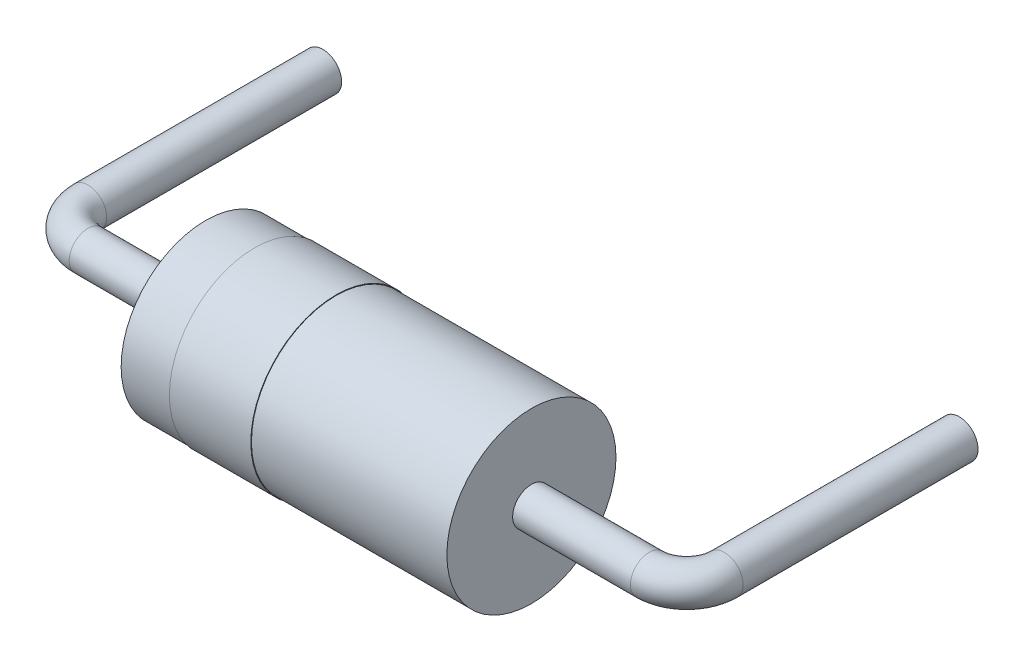
ISO-10303-21;
HEADER;
FILE_DESCRIPTION(('STEP AP214'),'2;1');
FILE_NAME('part.step','',(''),(''),'','','');
FILE_SCHEMA(('AUTOMOTIVE_DESIGN { 1 0 10303 214 1 1 1 1 }'));
ENDSEC;
DATA;
#1=APPLICATION_CONTEXT('core data for automotive mechanical design processes');
#2=APPLICATION_PROTOCOL_DEFINITION('international standard','automotive_design',2000,#1);
#3=PRODUCT_CONTEXT('',#1,'mechanical');
#4=PRODUCT('Part','Part','',(#3));
#5=PRODUCT_RELATED_PRODUCT_CATEGORY('part','',(#4));
#6=PRODUCT_DEFINITION_FORMATION('','',#4);
#7=PRODUCT_DEFINITION_CONTEXT('part definition',#1,'design');
#8=PRODUCT_DEFINITION('design','',#6,#7);
#9=PRODUCT_DEFINITION_SHAPE('','',#8);
#10=(LENGTH_UNIT() NAMED_UNIT(*) SI_UNIT(.MILLI.,.METRE.));
#11=(NAMED_UNIT(*) PLANE_ANGLE_UNIT() SI_UNIT($,.RADIAN.));
#12=(NAMED_UNIT(*) SI_UNIT($,.STERADIAN.) SOLID_ANGLE_UNIT());
#13=UNCERTAINTY_MEASURE_WITH_UNIT(LENGTH_MEASURE(1.E-05),#10,'distance_accuracy_value','');
#14=(GEOMETRIC_REPRESENTATION_CONTEXT(3) GLOBAL_UNCERTAINTY_ASSIGNED_CONTEXT((#13)) GLOBAL_UNIT_ASSIGNED_CONTEXT((#10,
#11,#12)) REPRESENTATION_CONTEXT('',''));
#15=CARTESIAN_POINT('',(0.,0.,0.));
#16=DIRECTION('',(0.,0.,1.));
#17=DIRECTION('',(1.,0.,0.));
#18=AXIS2_PLACEMENT_3D('',#15,#16,#17);
#19=CARTESIAN_POINT('',(9.86,0.,-2.5));
#20=DIRECTION('',(0.,0.,1.));
#21=DIRECTION('',(1.,0.,0.));
#22=AXIS2_PLACEMENT_3D('',#19,#20,#21);
#23=PLANE('',#22);
#24=CARTESIAN_POINT('',(10.16,0.,-2.5));
#25=DIRECTION('',(0.,0.,-1.));
#26=DIRECTION('',(-1.,0.,0.));
#27=AXIS2_PLACEMENT_3D('',#24,#25,#26);
#28=CIRCLE('',#27,0.3);
#29=CARTESIAN_POINT('',(9.86,0.,-2.5));
#30=VERTEX_POINT('',#29);
#31=EDGE_CURVE('E11',#30,#30,#28,.T.);
#32=ORIENTED_EDGE('',*,*,#31,.T.);
#33=EDGE_LOOP('',(#32));
#34=FACE_BOUND('',#33,.T.);
#35=ADVANCED_FACE('F17',(#34),#23,.F.);
#36=CARTESIAN_POINT('',(0.3,0.,-2.5));
#37=DIRECTION('',(0.,0.,-1.));
#38=DIRECTION('',(0.,-1.,0.));
#39=AXIS2_PLACEMENT_3D('',#36,#37,#38);
#40=PLANE('',#39);
#41=CARTESIAN_POINT('',(0.,0.,-2.5));
#42=DIRECTION('',(0.,0.,1.));
#43=DIRECTION('',(1.,0.,0.));
#44=AXIS2_PLACEMENT_3D('',#41,#42,#43);
#45=CIRCLE('',#44,0.3);
#46=CARTESIAN_POINT('',(0.3,0.,-2.5));
#47=VERTEX_POINT('',#46);
#48=EDGE_CURVE('E161',#47,#47,#45,.T.);
#49=ORIENTED_EDGE('',*,*,#48,.F.);
#50=EDGE_LOOP('',(#49));
#51=FACE_BOUND('',#50,.T.);
#52=ADVANCED_FACE('F19',(#51),#40,.T.);
#53=CARTESIAN_POINT('',(10.16,0.,1.25));
#54=DIRECTION('',(0.,0.,-1.));
#55=DIRECTION('',(-1.,0.,0.));
#56=AXIS2_PLACEMENT_3D('',#53,#54,#55);
#57=CYLINDRICAL_SURFACE('',#56,0.3);
#58=DIRECTION('',(0.,0.,-1.));
#59=VECTOR('',#58,1.);
#60=CARTESIAN_POINT('',(9.86,0.,1.25));
#61=LINE('',#60,#59);
#62=CARTESIAN_POINT('',(9.86,0.,1.25));
#63=VERTEX_POINT('',#62);
#64=EDGE_CURVE('E30',#63,#30,#61,.T.);
#65=ORIENTED_EDGE('',*,*,#64,.T.);
#66=ORIENTED_EDGE('',*,*,#31,.F.);
#67=ORIENTED_EDGE('',*,*,#64,.F.);
#68=CARTESIAN_POINT('',(10.16,0.,1.25));
#69=DIRECTION('',(0.,0.,1.));
#70=DIRECTION('',(1.,0.,0.));
#71=AXIS2_PLACEMENT_3D('',#68,#69,#70);
#72=CIRCLE('',#71,0.3);
#73=EDGE_CURVE('E152',#63,#63,#72,.T.);
#74=ORIENTED_EDGE('',*,*,#73,.F.);
#75=EDGE_LOOP('',(#65,#66,#67,#74));
#76=FACE_BOUND('',#75,.T.);
#77=ADVANCED_FACE('F169',(#76),#57,.T.);
#78=CARTESIAN_POINT('',(0.,0.,1.25));
#79=DIRECTION('',(0.,0.,1.));
#80=DIRECTION('',(1.,0.,0.));
#81=AXIS2_PLACEMENT_3D('',#78,#79,#80);
#82=CYLINDRICAL_SURFACE('',#81,0.3);
#83=DIRECTION('',(0.,0.,1.));
#84=VECTOR('',#83,1.);
#85=CARTESIAN_POINT('',(0.3,0.,1.25));
#86=LINE('',#85,#84);
#87=CARTESIAN_POINT('',(0.3,0.,1.25));
#88=VERTEX_POINT('',#87);
#89=EDGE_CURVE('E158',#47,#88,#86,.T.);
#90=ORIENTED_EDGE('',*,*,#89,.T.);
#91=CARTESIAN_POINT('',(0.,0.,1.25));
#92=DIRECTION('',(0.,0.,1.));
#93=DIRECTION('',(1.,0.,0.));
#94=AXIS2_PLACEMENT_3D('',#91,#92,#93);
#95=CIRCLE('',#94,0.3);
#96=EDGE_CURVE('E143',#88,#88,#95,.T.);
#97=ORIENTED_EDGE('',*,*,#96,.F.);
#98=ORIENTED_EDGE('',*,*,#89,.F.);
#99=ORIENTED_EDGE('',*,*,#48,.T.);
#100=EDGE_LOOP('',(#90,#97,#98,#99));
#101=FACE_BOUND('',#100,.T.);
#102=ADVANCED_FACE('F226',(#101),#82,.T.);
#103=CARTESIAN_POINT('',(9.56,0.,1.25));
#104=DIRECTION('',(0.,1.,0.));
#105=DIRECTION('',(1.,0.,0.));
#106=AXIS2_PLACEMENT_3D('',#103,#104,#105);
#107=TOROIDAL_SURFACE('',#106,0.6,0.3);
#108=CARTESIAN_POINT('',(9.56,0.,1.25));
#109=DIRECTION('',(0.,1.,0.));
#110=DIRECTION('',(1.,0.,0.));
#111=AXIS2_PLACEMENT_3D('',#108,#109,#110);
#112=CIRCLE('',#111,0.3);
#113=CARTESIAN_POINT('',(9.56,0.,1.55));
#114=VERTEX_POINT('',#113);
#115=EDGE_CURVE('E147',#114,#63,#112,.T.);
#116=ORIENTED_EDGE('',*,*,#115,.T.);
#117=ORIENTED_EDGE('',*,*,#73,.T.);
#118=ORIENTED_EDGE('',*,*,#115,.F.);
#119=CARTESIAN_POINT('',(9.56,0.,1.85));
#120=DIRECTION('',(1.,0.,0.));
#121=DIRECTION('',(0.,0.,-1.));
#122=AXIS2_PLACEMENT_3D('',#119,#120,#121);
#123=CIRCLE('',#122,0.3);
#124=EDGE_CURVE('E115',#114,#114,#123,.T.);
#125=ORIENTED_EDGE('',*,*,#124,.T.);
#126=EDGE_LOOP('',(#116,#117,#118,#125));
#127=FACE_BOUND('',#126,.T.);
#128=ADVANCED_FACE('F168',(#127),#107,.T.);
#129=CARTESIAN_POINT('',(0.6,0.,1.25));
#130=DIRECTION('',(0.,1.,0.));
#131=DIRECTION('',(1.,0.,0.));
#132=AXIS2_PLACEMENT_3D('',#129,#130,#131);
#133=TOROIDAL_SURFACE('',#132,0.6,0.3);
#134=CARTESIAN_POINT('',(0.6,0.,1.25));
#135=DIRECTION('',(0.,1.,0.));
#136=DIRECTION('',(1.,0.,0.));
#137=AXIS2_PLACEMENT_3D('',#134,#135,#136);
#138=CIRCLE('',#137,0.3);
#139=CARTESIAN_POINT('',(0.6,0.,1.55));
#140=VERTEX_POINT('',#139);
#141=EDGE_CURVE('E116',#88,#140,#138,.T.);
#142=ORIENTED_EDGE('',*,*,#141,.T.);
#143=CARTESIAN_POINT('',(0.6,0.,1.85));
#144=DIRECTION('',(-1.,0.,0.));
#145=DIRECTION('',(0.,0.,1.));
#146=AXIS2_PLACEMENT_3D('',#143,#144,#145);
#147=CIRCLE('',#146,0.3);
#148=EDGE_CURVE('E137',#140,#140,#147,.T.);
#149=ORIENTED_EDGE('',*,*,#148,.T.);
#150=ORIENTED_EDGE('',*,*,#141,.F.);
#151=ORIENTED_EDGE('',*,*,#96,.T.);
#152=EDGE_LOOP('',(#142,#149,#150,#151));
#153=FACE_BOUND('',#152,.T.);
#154=ADVANCED_FACE('F222',(#153),#133,.T.);
#155=CARTESIAN_POINT('',(0.6,0.,1.85));
#156=DIRECTION('',(1.,0.,0.));
#157=DIRECTION('',(0.,0.,-1.));
#158=AXIS2_PLACEMENT_3D('',#155,#156,#157);
#159=CYLINDRICAL_SURFACE('',#158,0.3);
#160=CARTESIAN_POINT('',(7.68,0.,1.85));
#161=DIRECTION('',(1.,0.,0.));
#162=DIRECTION('',(0.,0.,-1.));
#163=AXIS2_PLACEMENT_3D('',#160,#161,#162);
#164=CIRCLE('',#163,0.3);
#165=CARTESIAN_POINT('',(7.68,0.,1.55));
#166=VERTEX_POINT('',#165);
#167=EDGE_CURVE('E128',#166,#166,#164,.T.);
#168=ORIENTED_EDGE('',*,*,#167,.T.);
#169=DIRECTION('',(1.,0.,0.));
#170=VECTOR('',#169,1.);
#171=CARTESIAN_POINT('',(0.6,0.,1.55));
#172=LINE('',#171,#170);
#173=EDGE_CURVE('E117',#166,#114,#172,.T.);
#174=ORIENTED_EDGE('',*,*,#173,.T.);
#175=ORIENTED_EDGE('',*,*,#124,.F.);
#176=ORIENTED_EDGE('',*,*,#173,.F.);
#177=EDGE_LOOP('',(#168,#174,#175,#176));
#178=FACE_BOUND('',#177,.T.);
#179=ADVANCED_FACE('F174',(#178),#159,.T.);
#180=CARTESIAN_POINT('',(0.6,0.,1.85));
#181=DIRECTION('',(1.,0.,0.));
#182=DIRECTION('',(0.,0.,-1.));
#183=AXIS2_PLACEMENT_3D('',#180,#181,#182);
#184=CYLINDRICAL_SURFACE('',#183,0.3);
#185=ORIENTED_EDGE('',*,*,#148,.F.);
#186=DIRECTION('',(1.,0.,0.));
#187=VECTOR('',#186,1.);
#188=CARTESIAN_POINT('',(0.6,0.,1.55));
#189=LINE('',#188,#187);
#190=CARTESIAN_POINT('',(2.48,0.,1.55));
#191=VERTEX_POINT('',#190);
#192=EDGE_CURVE('E135',#140,#191,#189,.T.);
#193=ORIENTED_EDGE('',*,*,#192,.T.);
#194=CARTESIAN_POINT('',(2.48,0.,1.85));
#195=DIRECTION('',(1.,0.,0.));
#196=DIRECTION('',(0.,0.,-1.));
#197=AXIS2_PLACEMENT_3D('',#194,#195,#196);
#198=CIRCLE('',#197,0.3);
#199=EDGE_CURVE('E122',#191,#191,#198,.T.);
#200=ORIENTED_EDGE('',*,*,#199,.F.);
#201=ORIENTED_EDGE('',*,*,#192,.F.);
#202=EDGE_LOOP('',(#185,#193,#200,#201));
#203=FACE_BOUND('',#202,.T.);
#204=ADVANCED_FACE('F179',(#203),#184,.T.);
#205=CARTESIAN_POINT('',(7.68,0.,1.85));
#206=DIRECTION('',(1.,0.,0.));
#207=DIRECTION('',(0.,1.,0.));
#208=AXIS2_PLACEMENT_3D('',#205,#206,#207);
#209=PLANE('',#208);
#210=ORIENTED_EDGE('',*,*,#167,.F.);
#211=EDGE_LOOP('',(#210));
#212=FACE_BOUND('',#211,.T.);
#213=CARTESIAN_POINT('',(7.68,0.,1.85));
#214=DIRECTION('',(1.,0.,0.));
#215=DIRECTION('',(0.,0.,1.));
#216=AXIS2_PLACEMENT_3D('',#213,#214,#215);
#217=CIRCLE('',#216,1.35);
#218=CARTESIAN_POINT('',(7.68,0.,3.2));
#219=VERTEX_POINT('',#218);
#220=EDGE_CURVE('E125',#219,#219,#217,.T.);
#221=ORIENTED_EDGE('',*,*,#220,.T.);
#222=EDGE_LOOP('',(#221));
#223=FACE_BOUND('',#222,.T.);
#224=ADVANCED_FACE('F176',(#212,#223),#209,.T.);
#225=CARTESIAN_POINT('',(2.48,0.,1.85));
#226=DIRECTION('',(1.,0.,0.));
#227=DIRECTION('',(0.,1.,0.));
#228=AXIS2_PLACEMENT_3D('',#225,#226,#227);
#229=PLANE('',#228);
#230=ORIENTED_EDGE('',*,*,#199,.T.);
#231=EDGE_LOOP('',(#230));
#232=FACE_BOUND('',#231,.T.);
#233=CARTESIAN_POINT('',(2.48,0.,1.85));
#234=DIRECTION('',(1.,0.,0.));
#235=DIRECTION('',(0.,0.,1.));
#236=AXIS2_PLACEMENT_3D('',#233,#234,#235);
#237=CIRCLE('',#236,1.35);
#238=CARTESIAN_POINT('',(2.48,0.,3.2));
#239=VERTEX_POINT('',#238);
#240=EDGE_CURVE('E123',#239,#239,#237,.T.);
#241=ORIENTED_EDGE('',*,*,#240,.F.);
#242=EDGE_LOOP('',(#241));
#243=FACE_BOUND('',#242,.T.);
#244=ADVANCED_FACE('F177',(#232,#243),#229,.F.);
#245=CARTESIAN_POINT('',(2.48,0.,1.85));
#246=DIRECTION('',(1.,0.,0.));
#247=DIRECTION('',(0.,0.,1.));
#248=AXIS2_PLACEMENT_3D('',#245,#246,#247);
#249=CYLINDRICAL_SURFACE('',#248,1.35);
#250=CARTESIAN_POINT('',(4.56,0.,1.85));
#251=DIRECTION('',(1.,0.,0.));
#252=DIRECTION('',(0.,0.,1.));
#253=AXIS2_PLACEMENT_3D('',#250,#251,#252);
#254=CIRCLE('',#253,1.35);
#255=CARTESIAN_POINT('',(4.56,0.,3.2));
#256=VERTEX_POINT('',#255);
#257=EDGE_CURVE('E110',#256,#256,#254,.T.);
#258=ORIENTED_EDGE('',*,*,#257,.T.);
#259=DIRECTION('',(1.,0.,0.));
#260=VECTOR('',#259,1.);
#261=CARTESIAN_POINT('',(2.48,0.,3.2));
#262=LINE('',#261,#260);
#263=EDGE_CURVE('E119',#256,#219,#262,.T.);
#264=ORIENTED_EDGE('',*,*,#263,.T.);
#265=ORIENTED_EDGE('',*,*,#220,.F.);
#266=ORIENTED_EDGE('',*,*,#263,.F.);
#267=EDGE_LOOP('',(#258,#264,#265,#266));
#268=FACE_BOUND('',#267,.T.);
#269=ADVANCED_FACE('F182',(#268),#249,.T.);
#270=CARTESIAN_POINT('',(2.48,0.,1.85));
#271=DIRECTION('',(1.,0.,0.));
#272=DIRECTION('',(0.,0.,1.));
#273=AXIS2_PLACEMENT_3D('',#270,#271,#272);
#274=CYLINDRICAL_SURFACE('',#273,1.35);
#275=DIRECTION('',(1.,0.,0.));
#276=VECTOR('',#275,1.);
#277=CARTESIAN_POINT('',(2.48,0.,3.2));
#278=LINE('',#277,#276);
#279=CARTESIAN_POINT('',(3.26,0.,3.2));
#280=VERTEX_POINT('',#279);
#281=EDGE_CURVE('E112',#239,#280,#278,.T.);
#282=ORIENTED_EDGE('',*,*,#281,.F.);
#283=ORIENTED_EDGE('',*,*,#240,.T.);
#284=ORIENTED_EDGE('',*,*,#281,.T.);
#285=CARTESIAN_POINT('',(3.26,0.,1.85));
#286=DIRECTION('',(1.,0.,0.));
#287=DIRECTION('',(0.,0.,1.));
#288=AXIS2_PLACEMENT_3D('',#285,#286,#287);
#289=CIRCLE('',#288,1.35);
#290=EDGE_CURVE('E97',#280,#280,#289,.T.);
#291=ORIENTED_EDGE('',*,*,#290,.F.);
#292=EDGE_LOOP('',(#282,#283,#284,#291));
#293=FACE_BOUND('',#292,.T.);
#294=ADVANCED_FACE('F192',(#293),#274,.T.);
#295=CARTESIAN_POINT('',(4.56,0.,1.85));
#296=DIRECTION('',(1.,0.,0.));
#297=DIRECTION('',(0.,1.,0.));
#298=AXIS2_PLACEMENT_3D('',#295,#296,#297);
#299=PLANE('',#298);
#300=ORIENTED_EDGE('',*,*,#257,.F.);
#301=EDGE_LOOP('',(#300));
#302=FACE_BOUND('',#301,.T.);
#303=CARTESIAN_POINT('',(4.56,0.,1.85));
#304=DIRECTION('',(1.,0.,0.));
#305=DIRECTION('',(0.,0.,1.));
#306=AXIS2_PLACEMENT_3D('',#303,#304,#305);
#307=CIRCLE('',#306,1.36);
#308=CARTESIAN_POINT('',(4.56,0.,3.21));
#309=VERTEX_POINT('',#308);
#310=EDGE_CURVE('E91',#309,#309,#307,.T.);
#311=ORIENTED_EDGE('',*,*,#310,.T.);
#312=EDGE_LOOP('',(#311));
#313=FACE_BOUND('',#312,.T.);
#314=ADVANCED_FACE('F190',(#302,#313),#299,.T.);
#315=CARTESIAN_POINT('',(3.26,0.,1.85));
#316=DIRECTION('',(1.,0.,0.));
#317=DIRECTION('',(0.,1.,0.));
#318=AXIS2_PLACEMENT_3D('',#315,#316,#317);
#319=PLANE('',#318);
#320=ORIENTED_EDGE('',*,*,#290,.T.);
#321=EDGE_LOOP('',(#320));
#322=FACE_BOUND('',#321,.T.);
#323=CARTESIAN_POINT('',(3.26,0.,1.85));
#324=DIRECTION('',(1.,0.,0.));
#325=DIRECTION('',(0.,0.,1.));
#326=AXIS2_PLACEMENT_3D('',#323,#324,#325);
#327=CIRCLE('',#326,1.36);
#328=CARTESIAN_POINT('',(3.26,0.,3.21));
#329=VERTEX_POINT('',#328);
#330=EDGE_CURVE('E95',#329,#329,#327,.T.);
#331=ORIENTED_EDGE('',*,*,#330,.F.);
#332=EDGE_LOOP('',(#331));
#333=FACE_BOUND('',#332,.T.);
#334=ADVANCED_FACE('F189',(#322,#333),#319,.F.);
#335=CARTESIAN_POINT('',(3.26,0.,1.85));
#336=DIRECTION('',(1.,0.,0.));
#337=DIRECTION('',(0.,0.,1.));
#338=AXIS2_PLACEMENT_3D('',#335,#336,#337);
#339=CYLINDRICAL_SURFACE('',#338,1.36);
#340=ORIENTED_EDGE('',*,*,#330,.T.);
#341=DIRECTION('',(1.,0.,0.));
#342=VECTOR('',#341,1.);
#343=CARTESIAN_POINT('',(3.26,0.,3.21));
#344=LINE('',#343,#342);
#345=EDGE_CURVE('E90',#329,#309,#344,.T.);
#346=ORIENTED_EDGE('',*,*,#345,.T.);
#347=ORIENTED_EDGE('',*,*,#310,.F.);
#348=ORIENTED_EDGE('',*,*,#345,.F.);
#349=EDGE_LOOP('',(#340,#346,#347,#348));
#350=FACE_BOUND('',#349,.T.);
#351=ADVANCED_FACE('F89',(#350),#339,.T.);
#352=CLOSED_SHELL('',(#35,#52,#77,#102,#128,#154,#179,#204,#224,#244,#269,#294,#314,#334,#351));
#353=MANIFOLD_SOLID_BREP('B1',#352);
#354=ADVANCED_BREP_SHAPE_REPRESENTATION('',(#18,#353),#14);
#355=SHAPE_DEFINITION_REPRESENTATION(#9,#354);
ENDSEC;
END-ISO-10303-21;
